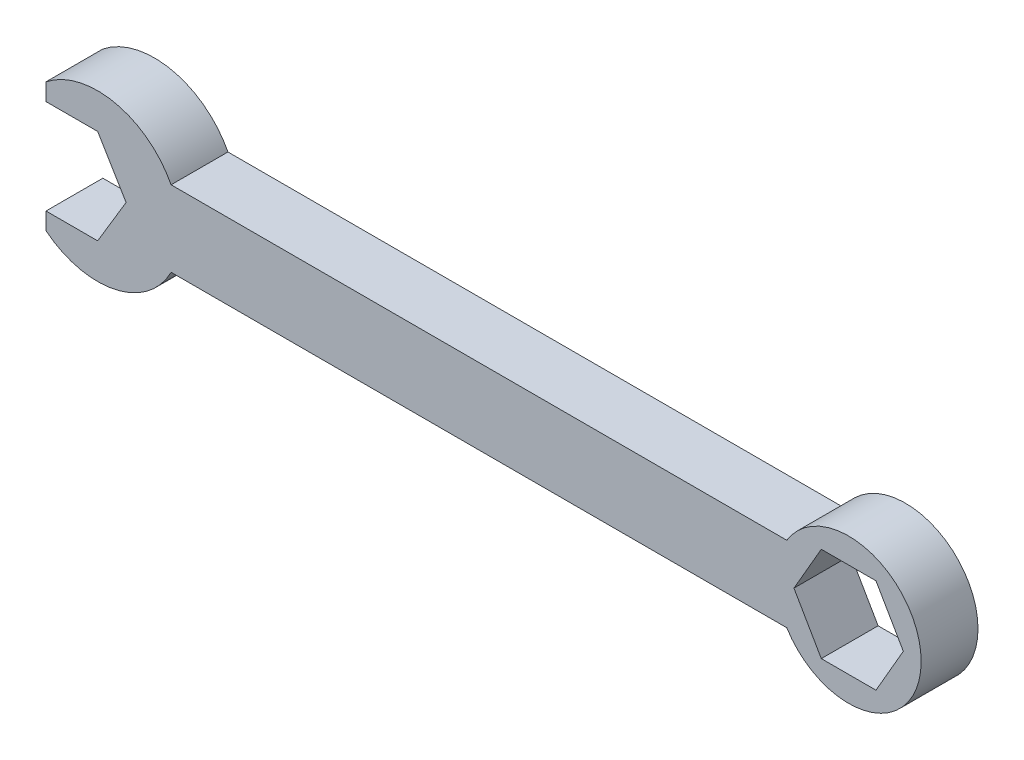
ISO-10303-21;
HEADER;
FILE_DESCRIPTION(('STEP AP214'),'2;1');
FILE_NAME('part.step','',(''),(''),'','','');
FILE_SCHEMA(('AUTOMOTIVE_DESIGN { 1 0 10303 214 1 1 1 1 }'));
ENDSEC;
DATA;
#1=APPLICATION_CONTEXT('core data for automotive mechanical design processes');
#2=APPLICATION_PROTOCOL_DEFINITION('international standard','automotive_design',2000,#1);
#3=PRODUCT_CONTEXT('',#1,'mechanical');
#4=PRODUCT('Part','Part','',(#3));
#5=PRODUCT_RELATED_PRODUCT_CATEGORY('part','',(#4));
#6=PRODUCT_DEFINITION_FORMATION('','',#4);
#7=PRODUCT_DEFINITION_CONTEXT('part definition',#1,'design');
#8=PRODUCT_DEFINITION('design','',#6,#7);
#9=PRODUCT_DEFINITION_SHAPE('','',#8);
#10=(LENGTH_UNIT() NAMED_UNIT(*) SI_UNIT(.MILLI.,.METRE.));
#11=(NAMED_UNIT(*) PLANE_ANGLE_UNIT() SI_UNIT($,.RADIAN.));
#12=(NAMED_UNIT(*) SI_UNIT($,.STERADIAN.) SOLID_ANGLE_UNIT());
#13=UNCERTAINTY_MEASURE_WITH_UNIT(LENGTH_MEASURE(1.E-05),#10,'distance_accuracy_value','');
#14=(GEOMETRIC_REPRESENTATION_CONTEXT(3) GLOBAL_UNCERTAINTY_ASSIGNED_CONTEXT((#13)) GLOBAL_UNIT_ASSIGNED_CONTEXT((#10,
#11,#12)) REPRESENTATION_CONTEXT('',''));
#15=CARTESIAN_POINT('',(0.,0.,0.));
#16=DIRECTION('',(0.,0.,1.));
#17=DIRECTION('',(1.,0.,0.));
#18=AXIS2_PLACEMENT_3D('',#15,#16,#17);
#19=CARTESIAN_POINT('',(5.49926131403123,-3.17499999999998,7.62));
#20=DIRECTION('',(-0.866025403784441,0.499999999999995,0.));
#21=DIRECTION('',(-0.499999999999995,-0.866025403784441,0.));
#22=AXIS2_PLACEMENT_3D('',#19,#20,#21);
#23=PLANE('',#22);
#24=DIRECTION('',(0.499999999999995,0.866025403784442,0.));
#25=VECTOR('',#24,1.);
#26=CARTESIAN_POINT('',(5.49926131403123,-3.17499999999998,0.));
#27=LINE('',#26,#25);
#28=CARTESIAN_POINT('',(3.6661742093542,-6.34999999999996,0.));
#29=VERTEX_POINT('',#28);
#30=CARTESIAN_POINT('',(7.33234841870825,0.,0.));
#31=VERTEX_POINT('',#30);
#32=EDGE_CURVE('E246',#29,#31,#27,.T.);
#33=ORIENTED_EDGE('',*,*,#32,.F.);
#34=DIRECTION('',(0.,0.,-1.));
#35=VECTOR('',#34,1.);
#36=CARTESIAN_POINT('',(3.6661742093542,-6.34999999999996,7.62));
#37=LINE('',#36,#35);
#38=CARTESIAN_POINT('',(3.6661742093542,-6.34999999999996,7.62));
#39=VERTEX_POINT('',#38);
#40=EDGE_CURVE('E11',#39,#29,#37,.T.);
#41=ORIENTED_EDGE('',*,*,#40,.F.);
#42=DIRECTION('',(0.499999999999995,0.866025403784442,0.));
#43=VECTOR('',#42,1.);
#44=CARTESIAN_POINT('',(5.49926131403123,-3.17499999999998,7.62));
#45=LINE('',#44,#43);
#46=CARTESIAN_POINT('',(7.33234841870825,0.,7.62));
#47=VERTEX_POINT('',#46);
#48=EDGE_CURVE('E387',#39,#47,#45,.T.);
#49=ORIENTED_EDGE('',*,*,#48,.T.);
#50=DIRECTION('',(0.,0.,-1.));
#51=VECTOR('',#50,1.);
#52=CARTESIAN_POINT('',(7.33234841870825,0.,7.62));
#53=LINE('',#52,#51);
#54=EDGE_CURVE('E67',#47,#31,#53,.T.);
#55=ORIENTED_EDGE('',*,*,#54,.T.);
#56=EDGE_LOOP('',(#33,#41,#49,#55));
#57=FACE_BOUND('',#56,.T.);
#58=ADVANCED_FACE('F47',(#57),#23,.T.);
#59=CARTESIAN_POINT('',(0.,-6.35,7.62));
#60=DIRECTION('',(0.,1.,0.));
#61=DIRECTION('',(-1.,0.,0.));
#62=AXIS2_PLACEMENT_3D('',#59,#60,#61);
#63=PLANE('',#62);
#64=DIRECTION('',(1.,0.,0.));
#65=VECTOR('',#64,1.);
#66=CARTESIAN_POINT('',(0.,-6.35,0.));
#67=LINE('',#66,#65);
#68=CARTESIAN_POINT('',(-3.66617420935407,-6.35000000000004,0.));
#69=VERTEX_POINT('',#68);
#70=EDGE_CURVE('E249',#69,#29,#67,.T.);
#71=ORIENTED_EDGE('',*,*,#70,.F.);
#72=DIRECTION('',(0.,0.,-1.));
#73=VECTOR('',#72,1.);
#74=CARTESIAN_POINT('',(-3.66617420935407,-6.35000000000004,7.62));
#75=LINE('',#74,#73);
#76=CARTESIAN_POINT('',(-3.66617420935407,-6.35000000000004,7.62));
#77=VERTEX_POINT('',#76);
#78=EDGE_CURVE('E58',#77,#69,#75,.T.);
#79=ORIENTED_EDGE('',*,*,#78,.F.);
#80=DIRECTION('',(1.,0.,0.));
#81=VECTOR('',#80,1.);
#82=CARTESIAN_POINT('',(0.,-6.35,7.62));
#83=LINE('',#82,#81);
#84=EDGE_CURVE('E390',#77,#39,#83,.T.);
#85=ORIENTED_EDGE('',*,*,#84,.T.);
#86=ORIENTED_EDGE('',*,*,#40,.T.);
#87=EDGE_LOOP('',(#71,#79,#85,#86));
#88=FACE_BOUND('',#87,.T.);
#89=ADVANCED_FACE('F412',(#88),#63,.T.);
#90=CARTESIAN_POINT('',(-5.49926131403116,-3.17500000000004,7.62));
#91=DIRECTION('',(0.866025403784435,0.500000000000007,0.));
#92=DIRECTION('',(-0.500000000000007,0.866025403784435,0.));
#93=AXIS2_PLACEMENT_3D('',#90,#91,#92);
#94=PLANE('',#93);
#95=DIRECTION('',(0.500000000000007,-0.866025403784435,0.));
#96=VECTOR('',#95,1.);
#97=CARTESIAN_POINT('',(-5.49926131403116,-3.17500000000004,0.));
#98=LINE('',#97,#96);
#99=CARTESIAN_POINT('',(-7.33234841870825,0.,0.));
#100=VERTEX_POINT('',#99);
#101=EDGE_CURVE('E253',#100,#69,#98,.T.);
#102=ORIENTED_EDGE('',*,*,#101,.F.);
#103=DIRECTION('',(0.,0.,-1.));
#104=VECTOR('',#103,1.);
#105=CARTESIAN_POINT('',(-7.33234841870825,0.,7.62));
#106=LINE('',#105,#104);
#107=CARTESIAN_POINT('',(-7.33234841870825,0.,7.62));
#108=VERTEX_POINT('',#107);
#109=EDGE_CURVE('E185',#108,#100,#106,.T.);
#110=ORIENTED_EDGE('',*,*,#109,.F.);
#111=DIRECTION('',(0.500000000000007,-0.866025403784435,0.));
#112=VECTOR('',#111,1.);
#113=CARTESIAN_POINT('',(-5.49926131403116,-3.17500000000004,7.62));
#114=LINE('',#113,#112);
#115=EDGE_CURVE('E196',#108,#77,#114,.T.);
#116=ORIENTED_EDGE('',*,*,#115,.T.);
#117=ORIENTED_EDGE('',*,*,#78,.T.);
#118=EDGE_LOOP('',(#102,#110,#116,#117));
#119=FACE_BOUND('',#118,.T.);
#120=ADVANCED_FACE('F397',(#119),#94,.T.);
#121=CARTESIAN_POINT('',(-5.4992613140312,3.17499999999997,7.62));
#122=DIRECTION('',(0.866025403784441,-0.499999999999995,0.));
#123=DIRECTION('',(0.499999999999995,0.866025403784442,0.));
#124=AXIS2_PLACEMENT_3D('',#121,#122,#123);
#125=PLANE('',#124);
#126=DIRECTION('',(-0.499999999999995,-0.866025403784442,0.));
#127=VECTOR('',#126,1.);
#128=CARTESIAN_POINT('',(-5.4992613140312,3.17499999999997,0.));
#129=LINE('',#128,#127);
#130=CARTESIAN_POINT('',(-3.66617420935415,6.34999999999999,0.));
#131=VERTEX_POINT('',#130);
#132=EDGE_CURVE('E180',#131,#100,#129,.T.);
#133=ORIENTED_EDGE('',*,*,#132,.F.);
#134=DIRECTION('',(0.,0.,-1.));
#135=VECTOR('',#134,1.);
#136=CARTESIAN_POINT('',(-3.66617420935415,6.34999999999999,7.62));
#137=LINE('',#136,#135);
#138=CARTESIAN_POINT('',(-3.66617420935415,6.34999999999999,7.62));
#139=VERTEX_POINT('',#138);
#140=EDGE_CURVE('E175',#139,#131,#137,.T.);
#141=ORIENTED_EDGE('',*,*,#140,.F.);
#142=DIRECTION('',(-0.499999999999995,-0.866025403784442,0.));
#143=VECTOR('',#142,1.);
#144=CARTESIAN_POINT('',(-5.4992613140312,3.17499999999997,7.62));
#145=LINE('',#144,#143);
#146=EDGE_CURVE('E178',#139,#108,#145,.T.);
#147=ORIENTED_EDGE('',*,*,#146,.T.);
#148=ORIENTED_EDGE('',*,*,#109,.T.);
#149=EDGE_LOOP('',(#133,#141,#147,#148));
#150=FACE_BOUND('',#149,.T.);
#151=ADVANCED_FACE('F177',(#150),#125,.T.);
#152=CARTESIAN_POINT('',(0.,6.34999999999999,7.62));
#153=DIRECTION('',(0.,-1.,0.));
#154=DIRECTION('',(1.,0.,0.));
#155=AXIS2_PLACEMENT_3D('',#152,#153,#154);
#156=PLANE('',#155);
#157=DIRECTION('',(-1.,0.,0.));
#158=VECTOR('',#157,1.);
#159=CARTESIAN_POINT('',(0.,6.34999999999999,0.));
#160=LINE('',#159,#158);
#161=CARTESIAN_POINT('',(3.66617420935412,6.35,0.));
#162=VERTEX_POINT('',#161);
#163=EDGE_CURVE('E259',#162,#131,#160,.T.);
#164=ORIENTED_EDGE('',*,*,#163,.F.);
#165=DIRECTION('',(0.,0.,-1.));
#166=VECTOR('',#165,1.);
#167=CARTESIAN_POINT('',(3.66617420935412,6.35,7.62));
#168=LINE('',#167,#166);
#169=CARTESIAN_POINT('',(3.66617420935412,6.35,7.62));
#170=VERTEX_POINT('',#169);
#171=EDGE_CURVE('E119',#170,#162,#168,.T.);
#172=ORIENTED_EDGE('',*,*,#171,.F.);
#173=DIRECTION('',(-1.,0.,0.));
#174=VECTOR('',#173,1.);
#175=CARTESIAN_POINT('',(0.,6.34999999999999,7.62));
#176=LINE('',#175,#174);
#177=EDGE_CURVE('E193',#170,#139,#176,.T.);
#178=ORIENTED_EDGE('',*,*,#177,.T.);
#179=ORIENTED_EDGE('',*,*,#140,.T.);
#180=EDGE_LOOP('',(#164,#172,#178,#179));
#181=FACE_BOUND('',#180,.T.);
#182=ADVANCED_FACE('F199',(#181),#156,.T.);
#183=CARTESIAN_POINT('',(-100.691706912067,0.,7.62));
#184=DIRECTION('',(0.,0.,-1.));
#185=DIRECTION('',(-1.,0.,0.));
#186=AXIS2_PLACEMENT_3D('',#183,#184,#185);
#187=CYLINDRICAL_SURFACE('',#186,11.0818050280781);
#188=CARTESIAN_POINT('',(-100.691706912067,0.,0.));
#189=DIRECTION('',(0.,0.,1.));
#190=DIRECTION('',(1.,0.,0.));
#191=AXIS2_PLACEMENT_3D('',#188,#189,#190);
#192=CIRCLE('',#191,11.0818050280781);
#193=CARTESIAN_POINT('',(-107.617835054615,-8.65073127737362,0.));
#194=VERTEX_POINT('',#193);
#195=CARTESIAN_POINT('',(-90.842848974197,-5.08,0.));
#196=VERTEX_POINT('',#195);
#197=EDGE_CURVE('E208',#194,#196,#192,.T.);
#198=ORIENTED_EDGE('',*,*,#197,.T.);
#199=DIRECTION('',(0.,0.,-1.));
#200=VECTOR('',#199,1.);
#201=CARTESIAN_POINT('',(-90.842848974197,-5.08,7.62));
#202=LINE('',#201,#200);
#203=CARTESIAN_POINT('',(-90.842848974197,-5.08,7.62));
#204=VERTEX_POINT('',#203);
#205=EDGE_CURVE('E51',#204,#196,#202,.T.);
#206=ORIENTED_EDGE('',*,*,#205,.F.);
#207=CARTESIAN_POINT('',(-100.691706912067,0.,7.62));
#208=DIRECTION('',(0.,0.,1.));
#209=DIRECTION('',(1.,0.,0.));
#210=AXIS2_PLACEMENT_3D('',#207,#208,#209);
#211=CIRCLE('',#210,11.0818050280781);
#212=CARTESIAN_POINT('',(-107.617835054615,-8.65073127737362,7.62));
#213=VERTEX_POINT('',#212);
#214=EDGE_CURVE('E266',#213,#204,#211,.T.);
#215=ORIENTED_EDGE('',*,*,#214,.F.);
#216=DIRECTION('',(0.,0.,-1.));
#217=VECTOR('',#216,1.);
#218=CARTESIAN_POINT('',(-107.617835054615,-8.65073127737362,7.62));
#219=LINE('',#218,#217);
#220=EDGE_CURVE('E204',#213,#194,#219,.T.);
#221=ORIENTED_EDGE('',*,*,#220,.T.);
#222=EDGE_LOOP('',(#198,#206,#215,#221));
#223=FACE_BOUND('',#222,.T.);
#224=ADVANCED_FACE('F314',(#223),#187,.T.);
#225=CARTESIAN_POINT('',(0.,-5.08,7.62));
#226=DIRECTION('',(0.,1.,0.));
#227=DIRECTION('',(0.,0.,1.));
#228=AXIS2_PLACEMENT_3D('',#225,#226,#227);
#229=PLANE('',#228);
#230=DIRECTION('',(1.,0.,0.));
#231=VECTOR('',#230,1.);
#232=CARTESIAN_POINT('',(0.,-5.08,0.));
#233=LINE('',#232,#231);
#234=CARTESIAN_POINT('',(-8.29284897419701,-5.08,0.));
#235=VERTEX_POINT('',#234);
#236=EDGE_CURVE('E212',#196,#235,#233,.T.);
#237=ORIENTED_EDGE('',*,*,#236,.T.);
#238=DIRECTION('',(0.,0.,-1.));
#239=VECTOR('',#238,1.);
#240=CARTESIAN_POINT('',(-8.29284897419701,-5.08,7.62));
#241=LINE('',#240,#239);
#242=CARTESIAN_POINT('',(-8.29284897419701,-5.08,7.62));
#243=VERTEX_POINT('',#242);
#244=EDGE_CURVE('E303',#243,#235,#241,.T.);
#245=ORIENTED_EDGE('',*,*,#244,.F.);
#246=DIRECTION('',(1.,0.,0.));
#247=VECTOR('',#246,1.);
#248=CARTESIAN_POINT('',(0.,-5.08,7.62));
#249=LINE('',#248,#247);
#250=EDGE_CURVE('E132',#204,#243,#249,.T.);
#251=ORIENTED_EDGE('',*,*,#250,.F.);
#252=ORIENTED_EDGE('',*,*,#205,.T.);
#253=EDGE_LOOP('',(#237,#245,#251,#252));
#254=FACE_BOUND('',#253,.T.);
#255=ADVANCED_FACE('F49',(#254),#229,.F.);
#256=CARTESIAN_POINT('',(0.,0.,7.62));
#257=DIRECTION('',(0.,0.,-1.));
#258=DIRECTION('',(-1.,0.,0.));
#259=AXIS2_PLACEMENT_3D('',#256,#257,#258);
#260=CYLINDRICAL_SURFACE('',#259,9.72510895100103);
#261=CARTESIAN_POINT('',(0.,0.,0.));
#262=DIRECTION('',(0.,0.,1.));
#263=DIRECTION('',(1.,0.,0.));
#264=AXIS2_PLACEMENT_3D('',#261,#262,#263);
#265=CIRCLE('',#264,9.72510895100103);
#266=CARTESIAN_POINT('',(-8.29284897419701,5.08,0.));
#267=VERTEX_POINT('',#266);
#268=EDGE_CURVE('E216',#235,#267,#265,.T.);
#269=ORIENTED_EDGE('',*,*,#268,.T.);
#270=DIRECTION('',(0.,0.,-1.));
#271=VECTOR('',#270,1.);
#272=CARTESIAN_POINT('',(-8.29284897419701,5.08,7.62));
#273=LINE('',#272,#271);
#274=CARTESIAN_POINT('',(-8.29284897419701,5.08,7.62));
#275=VERTEX_POINT('',#274);
#276=EDGE_CURVE('E301',#275,#267,#273,.T.);
#277=ORIENTED_EDGE('',*,*,#276,.F.);
#278=CARTESIAN_POINT('',(0.,0.,7.62));
#279=DIRECTION('',(0.,0.,1.));
#280=DIRECTION('',(1.,0.,0.));
#281=AXIS2_PLACEMENT_3D('',#278,#279,#280);
#282=CIRCLE('',#281,9.72510895100103);
#283=EDGE_CURVE('E366',#243,#275,#282,.T.);
#284=ORIENTED_EDGE('',*,*,#283,.F.);
#285=ORIENTED_EDGE('',*,*,#244,.T.);
#286=EDGE_LOOP('',(#269,#277,#284,#285));
#287=FACE_BOUND('',#286,.T.);
#288=ADVANCED_FACE('F435',(#287),#260,.T.);
#289=CARTESIAN_POINT('',(0.,5.08,7.62));
#290=DIRECTION('',(0.,1.,0.));
#291=DIRECTION('',(0.,0.,1.));
#292=AXIS2_PLACEMENT_3D('',#289,#290,#291);
#293=PLANE('',#292);
#294=DIRECTION('',(1.,0.,0.));
#295=VECTOR('',#294,1.);
#296=CARTESIAN_POINT('',(0.,5.08,0.));
#297=LINE('',#296,#295);
#298=CARTESIAN_POINT('',(-90.842848974197,5.08,0.));
#299=VERTEX_POINT('',#298);
#300=EDGE_CURVE('E220',#299,#267,#297,.T.);
#301=ORIENTED_EDGE('',*,*,#300,.F.);
#302=DIRECTION('',(0.,0.,-1.));
#303=VECTOR('',#302,1.);
#304=CARTESIAN_POINT('',(-90.842848974197,5.08,7.62));
#305=LINE('',#304,#303);
#306=CARTESIAN_POINT('',(-90.842848974197,5.08,7.62));
#307=VERTEX_POINT('',#306);
#308=EDGE_CURVE('E298',#307,#299,#305,.T.);
#309=ORIENTED_EDGE('',*,*,#308,.F.);
#310=DIRECTION('',(1.,0.,0.));
#311=VECTOR('',#310,1.);
#312=CARTESIAN_POINT('',(0.,5.08,7.62));
#313=LINE('',#312,#311);
#314=EDGE_CURVE('E369',#307,#275,#313,.T.);
#315=ORIENTED_EDGE('',*,*,#314,.T.);
#316=ORIENTED_EDGE('',*,*,#276,.T.);
#317=EDGE_LOOP('',(#301,#309,#315,#316));
#318=FACE_BOUND('',#317,.T.);
#319=ADVANCED_FACE('F433',(#318),#293,.T.);
#320=CARTESIAN_POINT('',(-107.617835054615,8.65073127737362,0.));
#321=VERTEX_POINT('',#320);
#322=EDGE_CURVE('E213',#299,#321,#192,.T.);
#323=ORIENTED_EDGE('',*,*,#322,.T.);
#324=DIRECTION('',(0.,0.,-1.));
#325=VECTOR('',#324,1.);
#326=CARTESIAN_POINT('',(-107.617835054615,8.65073127737362,7.62));
#327=LINE('',#326,#325);
#328=CARTESIAN_POINT('',(-107.617835054615,8.65073127737362,7.62));
#329=VERTEX_POINT('',#328);
#330=EDGE_CURVE('E294',#329,#321,#327,.T.);
#331=ORIENTED_EDGE('',*,*,#330,.F.);
#332=EDGE_CURVE('E359',#307,#329,#211,.T.);
#333=ORIENTED_EDGE('',*,*,#332,.F.);
#334=ORIENTED_EDGE('',*,*,#308,.T.);
#335=EDGE_LOOP('',(#323,#331,#333,#334));
#336=FACE_BOUND('',#335,.T.);
#337=ADVANCED_FACE('F358',(#336),#187,.T.);
#338=CARTESIAN_POINT('',(-107.617835054615,0.,7.62));
#339=DIRECTION('',(1.,0.,0.));
#340=DIRECTION('',(0.,0.,-1.));
#341=AXIS2_PLACEMENT_3D('',#338,#339,#340);
#342=PLANE('',#341);
#343=DIRECTION('',(0.,-1.,0.));
#344=VECTOR('',#343,1.);
#345=CARTESIAN_POINT('',(-107.617835054615,0.,0.));
#346=LINE('',#345,#344);
#347=CARTESIAN_POINT('',(-107.617835054615,6.35,0.));
#348=VERTEX_POINT('',#347);
#349=EDGE_CURVE('E224',#321,#348,#346,.T.);
#350=ORIENTED_EDGE('',*,*,#349,.T.);
#351=DIRECTION('',(0.,0.,-1.));
#352=VECTOR('',#351,1.);
#353=CARTESIAN_POINT('',(-107.617835054615,6.35,7.62));
#354=LINE('',#353,#352);
#355=CARTESIAN_POINT('',(-107.617835054615,6.35,7.62));
#356=VERTEX_POINT('',#355);
#357=EDGE_CURVE('E290',#356,#348,#354,.T.);
#358=ORIENTED_EDGE('',*,*,#357,.F.);
#359=DIRECTION('',(0.,-1.,0.));
#360=VECTOR('',#359,1.);
#361=CARTESIAN_POINT('',(-107.617835054615,0.,7.62));
#362=LINE('',#361,#360);
#363=EDGE_CURVE('E355',#329,#356,#362,.T.);
#364=ORIENTED_EDGE('',*,*,#363,.F.);
#365=ORIENTED_EDGE('',*,*,#330,.T.);
#366=EDGE_LOOP('',(#350,#358,#364,#365));
#367=FACE_BOUND('',#366,.T.);
#368=ADVANCED_FACE('F352',(#367),#342,.F.);
#369=CARTESIAN_POINT('',(0.,6.35,7.62));
#370=DIRECTION('',(0.,1.,0.));
#371=DIRECTION('',(0.,0.,1.));
#372=AXIS2_PLACEMENT_3D('',#369,#370,#371);
#373=PLANE('',#372);
#374=DIRECTION('',(1.,0.,0.));
#375=VECTOR('',#374,1.);
#376=CARTESIAN_POINT('',(0.,6.35,0.));
#377=LINE('',#376,#375);
#378=CARTESIAN_POINT('',(-100.691706912067,6.35,0.));
#379=VERTEX_POINT('',#378);
#380=EDGE_CURVE('E227',#348,#379,#377,.T.);
#381=ORIENTED_EDGE('',*,*,#380,.T.);
#382=DIRECTION('',(0.,0.,-1.));
#383=VECTOR('',#382,1.);
#384=CARTESIAN_POINT('',(-100.691706912067,6.35,7.62));
#385=LINE('',#384,#383);
#386=CARTESIAN_POINT('',(-100.691706912067,6.35,7.62));
#387=VERTEX_POINT('',#386);
#388=EDGE_CURVE('E286',#387,#379,#385,.T.);
#389=ORIENTED_EDGE('',*,*,#388,.F.);
#390=DIRECTION('',(1.,0.,0.));
#391=VECTOR('',#390,1.);
#392=CARTESIAN_POINT('',(0.,6.35,7.62));
#393=LINE('',#392,#391);
#394=EDGE_CURVE('E346',#356,#387,#393,.T.);
#395=ORIENTED_EDGE('',*,*,#394,.F.);
#396=ORIENTED_EDGE('',*,*,#357,.T.);
#397=EDGE_LOOP('',(#381,#389,#395,#396));
#398=FACE_BOUND('',#397,.T.);
#399=ADVANCED_FACE('F345',(#398),#373,.F.);
#400=CARTESIAN_POINT('',(-71.2365492000489,-42.7419295200294,7.62));
#401=DIRECTION('',(0.857492925712544,0.514495755427527,0.));
#402=DIRECTION('',(-0.514495755427527,0.857492925712544,0.));
#403=AXIS2_PLACEMENT_3D('',#400,#401,#402);
#404=PLANE('',#403);
#405=DIRECTION('',(0.514495755427527,-0.857492925712544,0.));
#406=VECTOR('',#405,1.);
#407=CARTESIAN_POINT('',(-71.2365492000489,-42.7419295200294,0.));
#408=LINE('',#407,#406);
#409=CARTESIAN_POINT('',(-96.8817069120666,0.,0.));
#410=VERTEX_POINT('',#409);
#411=EDGE_CURVE('E230',#379,#410,#408,.T.);
#412=ORIENTED_EDGE('',*,*,#411,.T.);
#413=DIRECTION('',(0.,0.,-1.));
#414=VECTOR('',#413,1.);
#415=CARTESIAN_POINT('',(-96.8817069120666,0.,7.62));
#416=LINE('',#415,#414);
#417=CARTESIAN_POINT('',(-96.8817069120666,0.,7.62));
#418=VERTEX_POINT('',#417);
#419=EDGE_CURVE('E283',#418,#410,#416,.T.);
#420=ORIENTED_EDGE('',*,*,#419,.F.);
#421=DIRECTION('',(0.514495755427527,-0.857492925712544,0.));
#422=VECTOR('',#421,1.);
#423=CARTESIAN_POINT('',(-71.2365492000489,-42.7419295200294,7.62));
#424=LINE('',#423,#422);
#425=EDGE_CURVE('E342',#387,#418,#424,.T.);
#426=ORIENTED_EDGE('',*,*,#425,.F.);
#427=ORIENTED_EDGE('',*,*,#388,.T.);
#428=EDGE_LOOP('',(#412,#420,#426,#427));
#429=FACE_BOUND('',#428,.T.);
#430=ADVANCED_FACE('F340',(#429),#404,.F.);
#431=CARTESIAN_POINT('',(-71.2365492000489,42.7419295200294,7.62));
#432=DIRECTION('',(-0.857492925712544,0.514495755427527,0.));
#433=DIRECTION('',(-0.514495755427527,-0.857492925712544,0.));
#434=AXIS2_PLACEMENT_3D('',#431,#432,#433);
#435=PLANE('',#434);
#436=DIRECTION('',(0.514495755427527,0.857492925712544,0.));
#437=VECTOR('',#436,1.);
#438=CARTESIAN_POINT('',(-71.2365492000489,42.7419295200294,0.));
#439=LINE('',#438,#437);
#440=CARTESIAN_POINT('',(-100.691706912067,-6.35,0.));
#441=VERTEX_POINT('',#440);
#442=EDGE_CURVE('E234',#441,#410,#439,.T.);
#443=ORIENTED_EDGE('',*,*,#442,.F.);
#444=DIRECTION('',(0.,0.,-1.));
#445=VECTOR('',#444,1.);
#446=CARTESIAN_POINT('',(-100.691706912067,-6.35,7.62));
#447=LINE('',#446,#445);
#448=CARTESIAN_POINT('',(-100.691706912067,-6.35,7.62));
#449=VERTEX_POINT('',#448);
#450=EDGE_CURVE('E280',#449,#441,#447,.T.);
#451=ORIENTED_EDGE('',*,*,#450,.F.);
#452=DIRECTION('',(0.514495755427527,0.857492925712544,0.));
#453=VECTOR('',#452,1.);
#454=CARTESIAN_POINT('',(-71.2365492000489,42.7419295200294,7.62));
#455=LINE('',#454,#453);
#456=EDGE_CURVE('E337',#449,#418,#455,.T.);
#457=ORIENTED_EDGE('',*,*,#456,.T.);
#458=ORIENTED_EDGE('',*,*,#419,.T.);
#459=EDGE_LOOP('',(#443,#451,#457,#458));
#460=FACE_BOUND('',#459,.T.);
#461=ADVANCED_FACE('F333',(#460),#435,.T.);
#462=CARTESIAN_POINT('',(0.,-6.35,7.62));
#463=DIRECTION('',(0.,1.,0.));
#464=DIRECTION('',(0.,0.,1.));
#465=AXIS2_PLACEMENT_3D('',#462,#463,#464);
#466=PLANE('',#465);
#467=DIRECTION('',(1.,0.,0.));
#468=VECTOR('',#467,1.);
#469=CARTESIAN_POINT('',(0.,-6.35,0.));
#470=LINE('',#469,#468);
#471=CARTESIAN_POINT('',(-107.617835054615,-6.35,0.));
#472=VERTEX_POINT('',#471);
#473=EDGE_CURVE('E238',#472,#441,#470,.T.);
#474=ORIENTED_EDGE('',*,*,#473,.F.);
#475=DIRECTION('',(0.,0.,-1.));
#476=VECTOR('',#475,1.);
#477=CARTESIAN_POINT('',(-107.617835054615,-6.35,7.62));
#478=LINE('',#477,#476);
#479=CARTESIAN_POINT('',(-107.617835054615,-6.35,7.62));
#480=VERTEX_POINT('',#479);
#481=EDGE_CURVE('E277',#480,#472,#478,.T.);
#482=ORIENTED_EDGE('',*,*,#481,.F.);
#483=DIRECTION('',(1.,0.,0.));
#484=VECTOR('',#483,1.);
#485=CARTESIAN_POINT('',(0.,-6.35,7.62));
#486=LINE('',#485,#484);
#487=EDGE_CURVE('E382',#480,#449,#486,.T.);
#488=ORIENTED_EDGE('',*,*,#487,.T.);
#489=ORIENTED_EDGE('',*,*,#450,.T.);
#490=EDGE_LOOP('',(#474,#482,#488,#489));
#491=FACE_BOUND('',#490,.T.);
#492=ADVANCED_FACE('F328',(#491),#466,.T.);
#493=CARTESIAN_POINT('',(-107.617835054615,0.,7.62));
#494=DIRECTION('',(-1.,0.,0.));
#495=DIRECTION('',(0.,0.,1.));
#496=AXIS2_PLACEMENT_3D('',#493,#494,#495);
#497=PLANE('',#496);
#498=DIRECTION('',(0.,1.,0.));
#499=VECTOR('',#498,1.);
#500=CARTESIAN_POINT('',(-107.617835054615,0.,0.));
#501=LINE('',#500,#499);
#502=EDGE_CURVE('E242',#194,#472,#501,.T.);
#503=ORIENTED_EDGE('',*,*,#502,.F.);
#504=ORIENTED_EDGE('',*,*,#220,.F.);
#505=DIRECTION('',(0.,1.,0.));
#506=VECTOR('',#505,1.);
#507=CARTESIAN_POINT('',(-107.617835054615,0.,7.62));
#508=LINE('',#507,#506);
#509=EDGE_CURVE('E324',#213,#480,#508,.T.);
#510=ORIENTED_EDGE('',*,*,#509,.T.);
#511=ORIENTED_EDGE('',*,*,#481,.T.);
#512=EDGE_LOOP('',(#503,#504,#510,#511));
#513=FACE_BOUND('',#512,.T.);
#514=ADVANCED_FACE('F320',(#513),#497,.T.);
#515=CARTESIAN_POINT('',(5.49926131403118,3.17500000000001,7.62));
#516=DIRECTION('',(-0.866025403784438,-0.500000000000001,0.));
#517=DIRECTION('',(0.500000000000001,-0.866025403784438,0.));
#518=AXIS2_PLACEMENT_3D('',#515,#516,#517);
#519=PLANE('',#518);
#520=DIRECTION('',(-0.500000000000001,0.866025403784438,0.));
#521=VECTOR('',#520,1.);
#522=CARTESIAN_POINT('',(5.49926131403118,3.17500000000001,0.));
#523=LINE('',#522,#521);
#524=EDGE_CURVE('E262',#31,#162,#523,.T.);
#525=ORIENTED_EDGE('',*,*,#524,.F.);
#526=ORIENTED_EDGE('',*,*,#54,.F.);
#527=DIRECTION('',(-0.500000000000001,0.866025403784438,0.));
#528=VECTOR('',#527,1.);
#529=CARTESIAN_POINT('',(5.49926131403118,3.17500000000001,7.62));
#530=LINE('',#529,#528);
#531=EDGE_CURVE('E201',#47,#170,#530,.T.);
#532=ORIENTED_EDGE('',*,*,#531,.T.);
#533=ORIENTED_EDGE('',*,*,#171,.T.);
#534=EDGE_LOOP('',(#525,#526,#532,#533));
#535=FACE_BOUND('',#534,.T.);
#536=ADVANCED_FACE('F399',(#535),#519,.T.);
#537=CARTESIAN_POINT('',(0.,0.,7.62));
#538=DIRECTION('',(0.,0.,1.));
#539=DIRECTION('',(1.,0.,0.));
#540=AXIS2_PLACEMENT_3D('',#537,#538,#539);
#541=PLANE('',#540);
#542=ORIENTED_EDGE('',*,*,#214,.T.);
#543=ORIENTED_EDGE('',*,*,#250,.T.);
#544=ORIENTED_EDGE('',*,*,#283,.T.);
#545=ORIENTED_EDGE('',*,*,#314,.F.);
#546=ORIENTED_EDGE('',*,*,#332,.T.);
#547=ORIENTED_EDGE('',*,*,#363,.T.);
#548=ORIENTED_EDGE('',*,*,#394,.T.);
#549=ORIENTED_EDGE('',*,*,#425,.T.);
#550=ORIENTED_EDGE('',*,*,#456,.F.);
#551=ORIENTED_EDGE('',*,*,#487,.F.);
#552=ORIENTED_EDGE('',*,*,#509,.F.);
#553=EDGE_LOOP('',(#542,#543,#544,#545,#546,#547,#548,#549,#550,#551,#552));
#554=FACE_BOUND('',#553,.T.);
#555=ORIENTED_EDGE('',*,*,#48,.F.);
#556=ORIENTED_EDGE('',*,*,#84,.F.);
#557=ORIENTED_EDGE('',*,*,#115,.F.);
#558=ORIENTED_EDGE('',*,*,#146,.F.);
#559=ORIENTED_EDGE('',*,*,#177,.F.);
#560=ORIENTED_EDGE('',*,*,#531,.F.);
#561=EDGE_LOOP('',(#555,#556,#557,#558,#559,#560));
#562=FACE_BOUND('',#561,.T.);
#563=ADVANCED_FACE('F191',(#554,#562),#541,.T.);
#564=CARTESIAN_POINT('',(0.,0.,0.));
#565=DIRECTION('',(0.,0.,1.));
#566=DIRECTION('',(1.,0.,0.));
#567=AXIS2_PLACEMENT_3D('',#564,#565,#566);
#568=PLANE('',#567);
#569=ORIENTED_EDGE('',*,*,#197,.F.);
#570=ORIENTED_EDGE('',*,*,#502,.T.);
#571=ORIENTED_EDGE('',*,*,#473,.T.);
#572=ORIENTED_EDGE('',*,*,#442,.T.);
#573=ORIENTED_EDGE('',*,*,#411,.F.);
#574=ORIENTED_EDGE('',*,*,#380,.F.);
#575=ORIENTED_EDGE('',*,*,#349,.F.);
#576=ORIENTED_EDGE('',*,*,#322,.F.);
#577=ORIENTED_EDGE('',*,*,#300,.T.);
#578=ORIENTED_EDGE('',*,*,#268,.F.);
#579=ORIENTED_EDGE('',*,*,#236,.F.);
#580=EDGE_LOOP('',(#569,#570,#571,#572,#573,#574,#575,#576,#577,#578,#579));
#581=FACE_BOUND('',#580,.T.);
#582=ORIENTED_EDGE('',*,*,#32,.T.);
#583=ORIENTED_EDGE('',*,*,#524,.T.);
#584=ORIENTED_EDGE('',*,*,#163,.T.);
#585=ORIENTED_EDGE('',*,*,#132,.T.);
#586=ORIENTED_EDGE('',*,*,#101,.T.);
#587=ORIENTED_EDGE('',*,*,#70,.T.);
#588=EDGE_LOOP('',(#582,#583,#584,#585,#586,#587));
#589=FACE_BOUND('',#588,.T.);
#590=ADVANCED_FACE('F317',(#581,#589),#568,.F.);
#591=CLOSED_SHELL('',(#58,#89,#120,#151,#182,#224,#255,#288,#319,#337,#368,#399,#430,#461,#492,
#514,#536,#563,#590));
#592=MANIFOLD_SOLID_BREP('B2',#591);
#593=ADVANCED_BREP_SHAPE_REPRESENTATION('',(#18,#592),#14);
#594=SHAPE_DEFINITION_REPRESENTATION(#9,#593);
ENDSEC;
END-ISO-10303-21;
